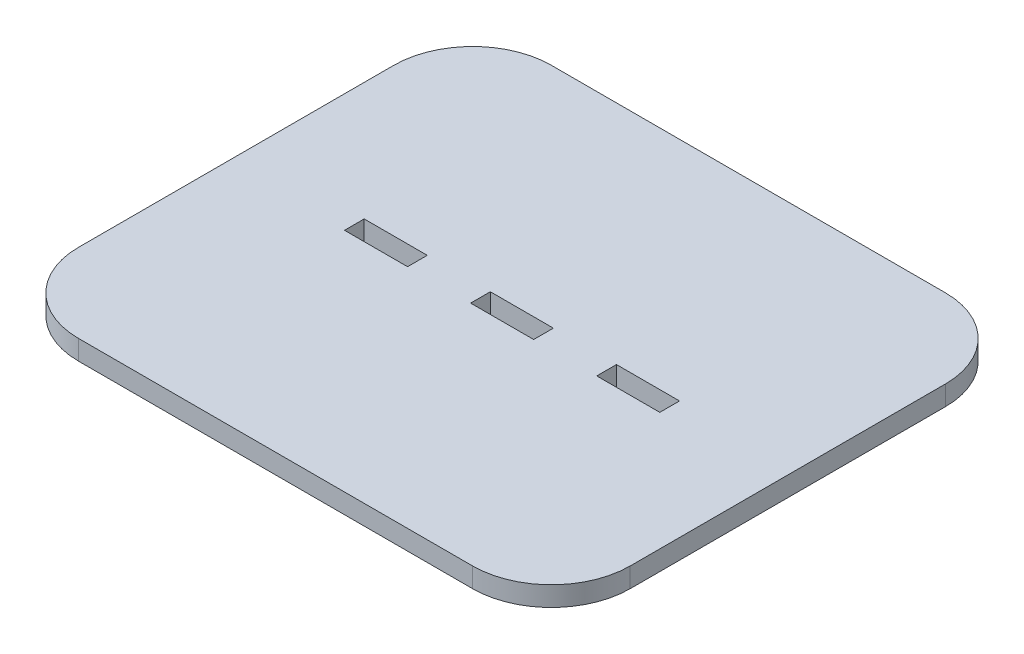
ISO-10303-21;
HEADER;
FILE_DESCRIPTION(('STEP AP214'),'2;1');
FILE_NAME('part.step','',(''),(''),'','','');
FILE_SCHEMA(('AUTOMOTIVE_DESIGN { 1 0 10303 214 1 1 1 1 }'));
ENDSEC;
DATA;
#1=APPLICATION_CONTEXT('core data for automotive mechanical design processes');
#2=APPLICATION_PROTOCOL_DEFINITION('international standard','automotive_design',2000,#1);
#3=PRODUCT_CONTEXT('',#1,'mechanical');
#4=PRODUCT('Part','Part','',(#3));
#5=PRODUCT_RELATED_PRODUCT_CATEGORY('part','',(#4));
#6=PRODUCT_DEFINITION_FORMATION('','',#4);
#7=PRODUCT_DEFINITION_CONTEXT('part definition',#1,'design');
#8=PRODUCT_DEFINITION('design','',#6,#7);
#9=PRODUCT_DEFINITION_SHAPE('','',#8);
#10=(LENGTH_UNIT() NAMED_UNIT(*) SI_UNIT(.MILLI.,.METRE.));
#11=(NAMED_UNIT(*) PLANE_ANGLE_UNIT() SI_UNIT($,.RADIAN.));
#12=(NAMED_UNIT(*) SI_UNIT($,.STERADIAN.) SOLID_ANGLE_UNIT());
#13=UNCERTAINTY_MEASURE_WITH_UNIT(LENGTH_MEASURE(1.E-05),#10,'distance_accuracy_value','');
#14=(GEOMETRIC_REPRESENTATION_CONTEXT(3) GLOBAL_UNCERTAINTY_ASSIGNED_CONTEXT((#13)) GLOBAL_UNIT_ASSIGNED_CONTEXT((#10,
#11,#12)) REPRESENTATION_CONTEXT('',''));
#15=CARTESIAN_POINT('',(0.,0.,0.));
#16=DIRECTION('',(0.,0.,1.));
#17=DIRECTION('',(1.,0.,0.));
#18=AXIS2_PLACEMENT_3D('',#15,#16,#17);
#19=CARTESIAN_POINT('',(-50.,5.,-40.));
#20=DIRECTION('',(0.,-1.,0.));
#21=DIRECTION('',(0.,0.,-1.));
#22=AXIS2_PLACEMENT_3D('',#19,#20,#21);
#23=PLANE('',#22);
#24=DIRECTION('',(1.,0.,0.));
#25=VECTOR('',#24,1.);
#26=CARTESIAN_POINT('',(24.,5.,2.5));
#27=LINE('',#26,#25);
#28=CARTESIAN_POINT('',(24.,5.,2.5));
#29=VERTEX_POINT('',#28);
#30=CARTESIAN_POINT('',(40.,5.,2.5));
#31=VERTEX_POINT('',#30);
#32=EDGE_CURVE('E206',#29,#31,#27,.T.);
#33=ORIENTED_EDGE('',*,*,#32,.F.);
#34=DIRECTION('',(0.,0.,1.));
#35=VECTOR('',#34,1.);
#36=CARTESIAN_POINT('',(24.,5.,-2.5));
#37=LINE('',#36,#35);
#38=CARTESIAN_POINT('',(24.,5.,-2.5));
#39=VERTEX_POINT('',#38);
#40=EDGE_CURVE('E214',#39,#29,#37,.T.);
#41=ORIENTED_EDGE('',*,*,#40,.F.);
#42=DIRECTION('',(-1.,0.,0.));
#43=VECTOR('',#42,1.);
#44=CARTESIAN_POINT('',(24.,5.,-2.5));
#45=LINE('',#44,#43);
#46=CARTESIAN_POINT('',(40.,5.,-2.5));
#47=VERTEX_POINT('',#46);
#48=EDGE_CURVE('E211',#47,#39,#45,.T.);
#49=ORIENTED_EDGE('',*,*,#48,.F.);
#50=DIRECTION('',(0.,0.,-1.));
#51=VECTOR('',#50,1.);
#52=CARTESIAN_POINT('',(40.,5.,-2.5));
#53=LINE('',#52,#51);
#54=EDGE_CURVE('E208',#31,#47,#53,.T.);
#55=ORIENTED_EDGE('',*,*,#54,.F.);
#56=EDGE_LOOP('',(#33,#41,#49,#55));
#57=FACE_BOUND('',#56,.T.);
#58=CARTESIAN_POINT('',(-50.,5.,-40.));
#59=DIRECTION('',(0.,1.,0.));
#60=DIRECTION('',(0.,0.,-1.));
#61=AXIS2_PLACEMENT_3D('',#58,#59,#60);
#62=CIRCLE('',#61,20.);
#63=CARTESIAN_POINT('',(-49.9999999999999,5.,-60.));
#64=VERTEX_POINT('',#63);
#65=CARTESIAN_POINT('',(-70.,5.,-39.9999999999998));
#66=VERTEX_POINT('',#65);
#67=EDGE_CURVE('E268',#64,#66,#62,.T.);
#68=ORIENTED_EDGE('',*,*,#67,.T.);
#69=DIRECTION('',(0.,0.,1.));
#70=VECTOR('',#69,1.);
#71=CARTESIAN_POINT('',(-70.,5.,-39.9999999999998));
#72=LINE('',#71,#70);
#73=CARTESIAN_POINT('',(-70.,5.,39.9999999999999));
#74=VERTEX_POINT('',#73);
#75=EDGE_CURVE('E271',#66,#74,#72,.T.);
#76=ORIENTED_EDGE('',*,*,#75,.T.);
#77=CARTESIAN_POINT('',(-50.,5.,40.));
#78=DIRECTION('',(0.,1.,0.));
#79=DIRECTION('',(0.,0.,-1.));
#80=AXIS2_PLACEMENT_3D('',#77,#78,#79);
#81=CIRCLE('',#80,20.);
#82=CARTESIAN_POINT('',(-49.9999999999999,5.,60.));
#83=VERTEX_POINT('',#82);
#84=EDGE_CURVE('E274',#74,#83,#81,.T.);
#85=ORIENTED_EDGE('',*,*,#84,.T.);
#86=DIRECTION('',(1.,0.,0.));
#87=VECTOR('',#86,1.);
#88=CARTESIAN_POINT('',(-49.9999999999999,5.,60.));
#89=LINE('',#88,#87);
#90=CARTESIAN_POINT('',(49.9999999999999,5.,60.));
#91=VERTEX_POINT('',#90);
#92=EDGE_CURVE('E276',#83,#91,#89,.T.);
#93=ORIENTED_EDGE('',*,*,#92,.T.);
#94=CARTESIAN_POINT('',(50.,5.,40.));
#95=DIRECTION('',(0.,1.,0.));
#96=DIRECTION('',(0.,0.,-1.));
#97=AXIS2_PLACEMENT_3D('',#94,#95,#96);
#98=CIRCLE('',#97,20.);
#99=CARTESIAN_POINT('',(70.,5.,39.9999999999999));
#100=VERTEX_POINT('',#99);
#101=EDGE_CURVE('E278',#91,#100,#98,.T.);
#102=ORIENTED_EDGE('',*,*,#101,.T.);
#103=DIRECTION('',(0.,0.,-1.));
#104=VECTOR('',#103,1.);
#105=CARTESIAN_POINT('',(70.,5.,-39.9999999999999));
#106=LINE('',#105,#104);
#107=CARTESIAN_POINT('',(70.,5.,-39.9999999999999));
#108=VERTEX_POINT('',#107);
#109=EDGE_CURVE('E280',#100,#108,#106,.T.);
#110=ORIENTED_EDGE('',*,*,#109,.T.);
#111=CARTESIAN_POINT('',(50.,5.,-40.));
#112=DIRECTION('',(0.,1.,0.));
#113=DIRECTION('',(0.,0.,-1.));
#114=AXIS2_PLACEMENT_3D('',#111,#112,#113);
#115=CIRCLE('',#114,20.);
#116=CARTESIAN_POINT('',(49.9999999999999,5.,-60.));
#117=VERTEX_POINT('',#116);
#118=EDGE_CURVE('E282',#108,#117,#115,.T.);
#119=ORIENTED_EDGE('',*,*,#118,.T.);
#120=DIRECTION('',(-1.,0.,0.));
#121=VECTOR('',#120,1.);
#122=CARTESIAN_POINT('',(-49.9999999999999,5.,-60.));
#123=LINE('',#122,#121);
#124=EDGE_CURVE('E284',#117,#64,#123,.T.);
#125=ORIENTED_EDGE('',*,*,#124,.T.);
#126=EDGE_LOOP('',(#68,#76,#85,#93,#102,#110,#119,#125));
#127=FACE_BOUND('',#126,.T.);
#128=DIRECTION('',(0.,0.,-1.));
#129=VECTOR('',#128,1.);
#130=CARTESIAN_POINT('',(-24.,5.,-2.5));
#131=LINE('',#130,#129);
#132=CARTESIAN_POINT('',(-24.,5.,2.5));
#133=VERTEX_POINT('',#132);
#134=CARTESIAN_POINT('',(-24.,5.,-2.5));
#135=VERTEX_POINT('',#134);
#136=EDGE_CURVE('E237',#133,#135,#131,.T.);
#137=ORIENTED_EDGE('',*,*,#136,.F.);
#138=DIRECTION('',(1.,0.,0.));
#139=VECTOR('',#138,1.);
#140=CARTESIAN_POINT('',(-40.,5.,2.5));
#141=LINE('',#140,#139);
#142=CARTESIAN_POINT('',(-40.,5.,2.5));
#143=VERTEX_POINT('',#142);
#144=EDGE_CURVE('E245',#143,#133,#141,.T.);
#145=ORIENTED_EDGE('',*,*,#144,.F.);
#146=DIRECTION('',(0.,0.,1.));
#147=VECTOR('',#146,1.);
#148=CARTESIAN_POINT('',(-40.,5.,-2.5));
#149=LINE('',#148,#147);
#150=CARTESIAN_POINT('',(-40.,5.,-2.5));
#151=VERTEX_POINT('',#150);
#152=EDGE_CURVE('E242',#151,#143,#149,.T.);
#153=ORIENTED_EDGE('',*,*,#152,.F.);
#154=DIRECTION('',(-1.,0.,0.));
#155=VECTOR('',#154,1.);
#156=CARTESIAN_POINT('',(-40.,5.,-2.5));
#157=LINE('',#156,#155);
#158=EDGE_CURVE('E239',#135,#151,#157,.T.);
#159=ORIENTED_EDGE('',*,*,#158,.F.);
#160=EDGE_LOOP('',(#137,#145,#153,#159));
#161=FACE_BOUND('',#160,.T.);
#162=DIRECTION('',(0.,0.,1.));
#163=VECTOR('',#162,1.);
#164=CARTESIAN_POINT('',(-7.99999999999997,5.,-2.5));
#165=LINE('',#164,#163);
#166=CARTESIAN_POINT('',(-7.99999999999997,5.,-2.5));
#167=VERTEX_POINT('',#166);
#168=CARTESIAN_POINT('',(-7.99999999999997,5.,2.5));
#169=VERTEX_POINT('',#168);
#170=EDGE_CURVE('E170',#167,#169,#165,.T.);
#171=ORIENTED_EDGE('',*,*,#170,.F.);
#172=DIRECTION('',(-1.,0.,0.));
#173=VECTOR('',#172,1.);
#174=CARTESIAN_POINT('',(-7.99999999999997,5.,-2.5));
#175=LINE('',#174,#173);
#176=CARTESIAN_POINT('',(8.00000000000003,5.,-2.5));
#177=VERTEX_POINT('',#176);
#178=EDGE_CURVE('E192',#177,#167,#175,.T.);
#179=ORIENTED_EDGE('',*,*,#178,.F.);
#180=DIRECTION('',(0.,0.,-1.));
#181=VECTOR('',#180,1.);
#182=CARTESIAN_POINT('',(8.00000000000003,5.,-2.5));
#183=LINE('',#182,#181);
#184=CARTESIAN_POINT('',(8.00000000000003,5.,2.5));
#185=VERTEX_POINT('',#184);
#186=EDGE_CURVE('E190',#185,#177,#183,.T.);
#187=ORIENTED_EDGE('',*,*,#186,.F.);
#188=DIRECTION('',(1.,0.,0.));
#189=VECTOR('',#188,1.);
#190=CARTESIAN_POINT('',(-7.99999999999997,5.,2.5));
#191=LINE('',#190,#189);
#192=EDGE_CURVE('E178',#169,#185,#191,.T.);
#193=ORIENTED_EDGE('',*,*,#192,.F.);
#194=EDGE_LOOP('',(#171,#179,#187,#193));
#195=FACE_BOUND('',#194,.T.);
#196=ADVANCED_FACE('F33',(#57,#127,#161,#195),#23,.F.);
#197=CARTESIAN_POINT('',(-50.,0.,-40.));
#198=DIRECTION('',(0.,-1.,0.));
#199=DIRECTION('',(0.,0.,-1.));
#200=AXIS2_PLACEMENT_3D('',#197,#198,#199);
#201=PLANE('',#200);
#202=CARTESIAN_POINT('',(-50.,0.,-40.));
#203=DIRECTION('',(0.,1.,0.));
#204=DIRECTION('',(0.,0.,-1.));
#205=AXIS2_PLACEMENT_3D('',#202,#203,#204);
#206=CIRCLE('',#205,20.);
#207=CARTESIAN_POINT('',(-49.9999999999999,0.,-60.));
#208=VERTEX_POINT('',#207);
#209=CARTESIAN_POINT('',(-70.,0.,-39.9999999999998));
#210=VERTEX_POINT('',#209);
#211=EDGE_CURVE('E267',#208,#210,#206,.T.);
#212=ORIENTED_EDGE('',*,*,#211,.F.);
#213=DIRECTION('',(-1.,0.,0.));
#214=VECTOR('',#213,1.);
#215=CARTESIAN_POINT('',(-49.9999999999999,0.,-60.));
#216=LINE('',#215,#214);
#217=CARTESIAN_POINT('',(49.9999999999999,0.,-60.));
#218=VERTEX_POINT('',#217);
#219=EDGE_CURVE('E272',#218,#208,#216,.T.);
#220=ORIENTED_EDGE('',*,*,#219,.F.);
#221=CARTESIAN_POINT('',(50.,0.,-40.));
#222=DIRECTION('',(0.,1.,0.));
#223=DIRECTION('',(0.,0.,-1.));
#224=AXIS2_PLACEMENT_3D('',#221,#222,#223);
#225=CIRCLE('',#224,20.);
#226=CARTESIAN_POINT('',(70.,0.,-39.9999999999999));
#227=VERTEX_POINT('',#226);
#228=EDGE_CURVE('E299',#227,#218,#225,.T.);
#229=ORIENTED_EDGE('',*,*,#228,.F.);
#230=DIRECTION('',(0.,0.,-1.));
#231=VECTOR('',#230,1.);
#232=CARTESIAN_POINT('',(70.,0.,-39.9999999999999));
#233=LINE('',#232,#231);
#234=CARTESIAN_POINT('',(70.,0.,39.9999999999999));
#235=VERTEX_POINT('',#234);
#236=EDGE_CURVE('E297',#235,#227,#233,.T.);
#237=ORIENTED_EDGE('',*,*,#236,.F.);
#238=CARTESIAN_POINT('',(50.,0.,40.));
#239=DIRECTION('',(0.,1.,0.));
#240=DIRECTION('',(0.,0.,-1.));
#241=AXIS2_PLACEMENT_3D('',#238,#239,#240);
#242=CIRCLE('',#241,20.);
#243=CARTESIAN_POINT('',(49.9999999999999,0.,60.));
#244=VERTEX_POINT('',#243);
#245=EDGE_CURVE('E295',#244,#235,#242,.T.);
#246=ORIENTED_EDGE('',*,*,#245,.F.);
#247=DIRECTION('',(1.,0.,0.));
#248=VECTOR('',#247,1.);
#249=CARTESIAN_POINT('',(-49.9999999999999,0.,60.));
#250=LINE('',#249,#248);
#251=CARTESIAN_POINT('',(-49.9999999999999,0.,60.));
#252=VERTEX_POINT('',#251);
#253=EDGE_CURVE('E293',#252,#244,#250,.T.);
#254=ORIENTED_EDGE('',*,*,#253,.F.);
#255=CARTESIAN_POINT('',(-50.,0.,40.));
#256=DIRECTION('',(0.,1.,0.));
#257=DIRECTION('',(0.,0.,-1.));
#258=AXIS2_PLACEMENT_3D('',#255,#256,#257);
#259=CIRCLE('',#258,20.);
#260=CARTESIAN_POINT('',(-70.,0.,39.9999999999999));
#261=VERTEX_POINT('',#260);
#262=EDGE_CURVE('E291',#261,#252,#259,.T.);
#263=ORIENTED_EDGE('',*,*,#262,.F.);
#264=DIRECTION('',(0.,0.,1.));
#265=VECTOR('',#264,1.);
#266=CARTESIAN_POINT('',(-70.,0.,-39.9999999999998));
#267=LINE('',#266,#265);
#268=EDGE_CURVE('E289',#210,#261,#267,.T.);
#269=ORIENTED_EDGE('',*,*,#268,.F.);
#270=EDGE_LOOP('',(#212,#220,#229,#237,#246,#254,#263,#269));
#271=FACE_BOUND('',#270,.T.);
#272=DIRECTION('',(1.,0.,0.));
#273=VECTOR('',#272,1.);
#274=CARTESIAN_POINT('',(-40.,0.,2.5));
#275=LINE('',#274,#273);
#276=CARTESIAN_POINT('',(-40.,0.,2.5));
#277=VERTEX_POINT('',#276);
#278=CARTESIAN_POINT('',(-24.,0.,2.5));
#279=VERTEX_POINT('',#278);
#280=EDGE_CURVE('E240',#277,#279,#275,.T.);
#281=ORIENTED_EDGE('',*,*,#280,.T.);
#282=DIRECTION('',(0.,0.,-1.));
#283=VECTOR('',#282,1.);
#284=CARTESIAN_POINT('',(-24.,0.,-2.5));
#285=LINE('',#284,#283);
#286=CARTESIAN_POINT('',(-24.,0.,-2.5));
#287=VERTEX_POINT('',#286);
#288=EDGE_CURVE('E236',#279,#287,#285,.T.);
#289=ORIENTED_EDGE('',*,*,#288,.T.);
#290=DIRECTION('',(-1.,0.,0.));
#291=VECTOR('',#290,1.);
#292=CARTESIAN_POINT('',(-40.,0.,-2.5));
#293=LINE('',#292,#291);
#294=CARTESIAN_POINT('',(-40.,0.,-2.5));
#295=VERTEX_POINT('',#294);
#296=EDGE_CURVE('E250',#287,#295,#293,.T.);
#297=ORIENTED_EDGE('',*,*,#296,.T.);
#298=DIRECTION('',(0.,0.,1.));
#299=VECTOR('',#298,1.);
#300=CARTESIAN_POINT('',(-40.,0.,-2.5));
#301=LINE('',#300,#299);
#302=EDGE_CURVE('E253',#295,#277,#301,.T.);
#303=ORIENTED_EDGE('',*,*,#302,.T.);
#304=EDGE_LOOP('',(#281,#289,#297,#303));
#305=FACE_BOUND('',#304,.T.);
#306=DIRECTION('',(0.,0.,1.));
#307=VECTOR('',#306,1.);
#308=CARTESIAN_POINT('',(24.,0.,-2.5));
#309=LINE('',#308,#307);
#310=CARTESIAN_POINT('',(24.,0.,-2.5));
#311=VERTEX_POINT('',#310);
#312=CARTESIAN_POINT('',(24.,0.,2.5));
#313=VERTEX_POINT('',#312);
#314=EDGE_CURVE('E209',#311,#313,#309,.T.);
#315=ORIENTED_EDGE('',*,*,#314,.T.);
#316=DIRECTION('',(1.,0.,0.));
#317=VECTOR('',#316,1.);
#318=CARTESIAN_POINT('',(24.,0.,2.5));
#319=LINE('',#318,#317);
#320=CARTESIAN_POINT('',(40.,0.,2.5));
#321=VERTEX_POINT('',#320);
#322=EDGE_CURVE('E186',#313,#321,#319,.T.);
#323=ORIENTED_EDGE('',*,*,#322,.T.);
#324=DIRECTION('',(0.,0.,-1.));
#325=VECTOR('',#324,1.);
#326=CARTESIAN_POINT('',(40.,0.,-2.5));
#327=LINE('',#326,#325);
#328=CARTESIAN_POINT('',(40.,0.,-2.5));
#329=VERTEX_POINT('',#328);
#330=EDGE_CURVE('E219',#321,#329,#327,.T.);
#331=ORIENTED_EDGE('',*,*,#330,.T.);
#332=DIRECTION('',(-1.,0.,0.));
#333=VECTOR('',#332,1.);
#334=CARTESIAN_POINT('',(24.,0.,-2.5));
#335=LINE('',#334,#333);
#336=EDGE_CURVE('E222',#329,#311,#335,.T.);
#337=ORIENTED_EDGE('',*,*,#336,.T.);
#338=EDGE_LOOP('',(#315,#323,#331,#337));
#339=FACE_BOUND('',#338,.T.);
#340=DIRECTION('',(-1.,0.,0.));
#341=VECTOR('',#340,1.);
#342=CARTESIAN_POINT('',(-7.99999999999997,0.,-2.5));
#343=LINE('',#342,#341);
#344=CARTESIAN_POINT('',(8.00000000000003,0.,-2.5));
#345=VERTEX_POINT('',#344);
#346=CARTESIAN_POINT('',(-7.99999999999997,0.,-2.5));
#347=VERTEX_POINT('',#346);
#348=EDGE_CURVE('E179',#345,#347,#343,.T.);
#349=ORIENTED_EDGE('',*,*,#348,.T.);
#350=DIRECTION('',(0.,0.,1.));
#351=VECTOR('',#350,1.);
#352=CARTESIAN_POINT('',(-7.99999999999997,0.,-2.5));
#353=LINE('',#352,#351);
#354=CARTESIAN_POINT('',(-7.99999999999997,0.,2.5));
#355=VERTEX_POINT('',#354);
#356=EDGE_CURVE('E56',#347,#355,#353,.T.);
#357=ORIENTED_EDGE('',*,*,#356,.T.);
#358=DIRECTION('',(1.,0.,0.));
#359=VECTOR('',#358,1.);
#360=CARTESIAN_POINT('',(-7.99999999999997,0.,2.5));
#361=LINE('',#360,#359);
#362=CARTESIAN_POINT('',(8.00000000000003,0.,2.5));
#363=VERTEX_POINT('',#362);
#364=EDGE_CURVE('E185',#355,#363,#361,.T.);
#365=ORIENTED_EDGE('',*,*,#364,.T.);
#366=DIRECTION('',(0.,0.,-1.));
#367=VECTOR('',#366,1.);
#368=CARTESIAN_POINT('',(8.00000000000003,0.,-2.5));
#369=LINE('',#368,#367);
#370=EDGE_CURVE('E198',#363,#345,#369,.T.);
#371=ORIENTED_EDGE('',*,*,#370,.T.);
#372=EDGE_LOOP('',(#349,#357,#365,#371));
#373=FACE_BOUND('',#372,.T.);
#374=ADVANCED_FACE('F329',(#271,#305,#339,#373),#201,.T.);
#375=CARTESIAN_POINT('',(-50.,5.,-40.));
#376=DIRECTION('',(0.,-1.,0.));
#377=DIRECTION('',(0.,0.,-1.));
#378=AXIS2_PLACEMENT_3D('',#375,#376,#377);
#379=CYLINDRICAL_SURFACE('',#378,20.);
#380=ORIENTED_EDGE('',*,*,#211,.T.);
#381=DIRECTION('',(0.,-1.,0.));
#382=VECTOR('',#381,1.);
#383=CARTESIAN_POINT('',(-70.,5.,-39.9999999999998));
#384=LINE('',#383,#382);
#385=EDGE_CURVE('E11',#66,#210,#384,.T.);
#386=ORIENTED_EDGE('',*,*,#385,.F.);
#387=ORIENTED_EDGE('',*,*,#67,.F.);
#388=DIRECTION('',(0.,-1.,0.));
#389=VECTOR('',#388,1.);
#390=CARTESIAN_POINT('',(-49.9999999999999,5.,-60.));
#391=LINE('',#390,#389);
#392=EDGE_CURVE('E286',#64,#208,#391,.T.);
#393=ORIENTED_EDGE('',*,*,#392,.T.);
#394=EDGE_LOOP('',(#380,#386,#387,#393));
#395=FACE_BOUND('',#394,.T.);
#396=ADVANCED_FACE('F35',(#395),#379,.T.);
#397=CARTESIAN_POINT('',(-70.,5.,-39.9999999999998));
#398=DIRECTION('',(1.,0.,0.));
#399=DIRECTION('',(0.,0.,-1.));
#400=AXIS2_PLACEMENT_3D('',#397,#398,#399);
#401=PLANE('',#400);
#402=ORIENTED_EDGE('',*,*,#268,.T.);
#403=DIRECTION('',(0.,-1.,0.));
#404=VECTOR('',#403,1.);
#405=CARTESIAN_POINT('',(-70.,5.,39.9999999999999));
#406=LINE('',#405,#404);
#407=EDGE_CURVE('E41',#74,#261,#406,.T.);
#408=ORIENTED_EDGE('',*,*,#407,.F.);
#409=ORIENTED_EDGE('',*,*,#75,.F.);
#410=ORIENTED_EDGE('',*,*,#385,.T.);
#411=EDGE_LOOP('',(#402,#408,#409,#410));
#412=FACE_BOUND('',#411,.T.);
#413=ADVANCED_FACE('F347',(#412),#401,.F.);
#414=CARTESIAN_POINT('',(-50.,5.,40.));
#415=DIRECTION('',(0.,-1.,0.));
#416=DIRECTION('',(0.,0.,-1.));
#417=AXIS2_PLACEMENT_3D('',#414,#415,#416);
#418=CYLINDRICAL_SURFACE('',#417,20.);
#419=ORIENTED_EDGE('',*,*,#262,.T.);
#420=DIRECTION('',(0.,-1.,0.));
#421=VECTOR('',#420,1.);
#422=CARTESIAN_POINT('',(-49.9999999999999,5.,60.));
#423=LINE('',#422,#421);
#424=EDGE_CURVE('E316',#83,#252,#423,.T.);
#425=ORIENTED_EDGE('',*,*,#424,.F.);
#426=ORIENTED_EDGE('',*,*,#84,.F.);
#427=ORIENTED_EDGE('',*,*,#407,.T.);
#428=EDGE_LOOP('',(#419,#425,#426,#427));
#429=FACE_BOUND('',#428,.T.);
#430=ADVANCED_FACE('F323',(#429),#418,.T.);
#431=CARTESIAN_POINT('',(-49.9999999999999,5.,60.));
#432=DIRECTION('',(0.,0.,-1.));
#433=DIRECTION('',(-1.,0.,0.));
#434=AXIS2_PLACEMENT_3D('',#431,#432,#433);
#435=PLANE('',#434);
#436=ORIENTED_EDGE('',*,*,#253,.T.);
#437=DIRECTION('',(0.,-1.,0.));
#438=VECTOR('',#437,1.);
#439=CARTESIAN_POINT('',(49.9999999999999,5.,60.));
#440=LINE('',#439,#438);
#441=EDGE_CURVE('E313',#91,#244,#440,.T.);
#442=ORIENTED_EDGE('',*,*,#441,.F.);
#443=ORIENTED_EDGE('',*,*,#92,.F.);
#444=ORIENTED_EDGE('',*,*,#424,.T.);
#445=EDGE_LOOP('',(#436,#442,#443,#444));
#446=FACE_BOUND('',#445,.T.);
#447=ADVANCED_FACE('F335',(#446),#435,.F.);
#448=CARTESIAN_POINT('',(50.,5.,40.));
#449=DIRECTION('',(0.,-1.,0.));
#450=DIRECTION('',(0.,0.,-1.));
#451=AXIS2_PLACEMENT_3D('',#448,#449,#450);
#452=CYLINDRICAL_SURFACE('',#451,20.);
#453=ORIENTED_EDGE('',*,*,#245,.T.);
#454=DIRECTION('',(0.,-1.,0.));
#455=VECTOR('',#454,1.);
#456=CARTESIAN_POINT('',(70.,5.,39.9999999999999));
#457=LINE('',#456,#455);
#458=EDGE_CURVE('E310',#100,#235,#457,.T.);
#459=ORIENTED_EDGE('',*,*,#458,.F.);
#460=ORIENTED_EDGE('',*,*,#101,.F.);
#461=ORIENTED_EDGE('',*,*,#441,.T.);
#462=EDGE_LOOP('',(#453,#459,#460,#461));
#463=FACE_BOUND('',#462,.T.);
#464=ADVANCED_FACE('F339',(#463),#452,.T.);
#465=CARTESIAN_POINT('',(70.,5.,-39.9999999999999));
#466=DIRECTION('',(-1.,0.,0.));
#467=DIRECTION('',(0.,0.,1.));
#468=AXIS2_PLACEMENT_3D('',#465,#466,#467);
#469=PLANE('',#468);
#470=ORIENTED_EDGE('',*,*,#236,.T.);
#471=DIRECTION('',(0.,-1.,0.));
#472=VECTOR('',#471,1.);
#473=CARTESIAN_POINT('',(70.,5.,-39.9999999999999));
#474=LINE('',#473,#472);
#475=EDGE_CURVE('E307',#108,#227,#474,.T.);
#476=ORIENTED_EDGE('',*,*,#475,.F.);
#477=ORIENTED_EDGE('',*,*,#109,.F.);
#478=ORIENTED_EDGE('',*,*,#458,.T.);
#479=EDGE_LOOP('',(#470,#476,#477,#478));
#480=FACE_BOUND('',#479,.T.);
#481=ADVANCED_FACE('F360',(#480),#469,.F.);
#482=CARTESIAN_POINT('',(50.,5.,-40.));
#483=DIRECTION('',(0.,-1.,0.));
#484=DIRECTION('',(0.,0.,-1.));
#485=AXIS2_PLACEMENT_3D('',#482,#483,#484);
#486=CYLINDRICAL_SURFACE('',#485,20.);
#487=ORIENTED_EDGE('',*,*,#228,.T.);
#488=DIRECTION('',(0.,-1.,0.));
#489=VECTOR('',#488,1.);
#490=CARTESIAN_POINT('',(49.9999999999999,5.,-60.));
#491=LINE('',#490,#489);
#492=EDGE_CURVE('E304',#117,#218,#491,.T.);
#493=ORIENTED_EDGE('',*,*,#492,.F.);
#494=ORIENTED_EDGE('',*,*,#118,.F.);
#495=ORIENTED_EDGE('',*,*,#475,.T.);
#496=EDGE_LOOP('',(#487,#493,#494,#495));
#497=FACE_BOUND('',#496,.T.);
#498=ADVANCED_FACE('F358',(#497),#486,.T.);
#499=CARTESIAN_POINT('',(-49.9999999999999,5.,-60.));
#500=DIRECTION('',(0.,0.,1.));
#501=DIRECTION('',(1.,0.,0.));
#502=AXIS2_PLACEMENT_3D('',#499,#500,#501);
#503=PLANE('',#502);
#504=ORIENTED_EDGE('',*,*,#219,.T.);
#505=ORIENTED_EDGE('',*,*,#392,.F.);
#506=ORIENTED_EDGE('',*,*,#124,.F.);
#507=ORIENTED_EDGE('',*,*,#492,.T.);
#508=EDGE_LOOP('',(#504,#505,#506,#507));
#509=FACE_BOUND('',#508,.T.);
#510=ADVANCED_FACE('F353',(#509),#503,.F.);
#511=CARTESIAN_POINT('',(-24.,5.,-2.5));
#512=DIRECTION('',(-1.,0.,0.));
#513=DIRECTION('',(0.,0.,1.));
#514=AXIS2_PLACEMENT_3D('',#511,#512,#513);
#515=PLANE('',#514);
#516=ORIENTED_EDGE('',*,*,#288,.F.);
#517=DIRECTION('',(0.,-1.,0.));
#518=VECTOR('',#517,1.);
#519=CARTESIAN_POINT('',(-24.,5.,2.5));
#520=LINE('',#519,#518);
#521=EDGE_CURVE('E247',#133,#279,#520,.T.);
#522=ORIENTED_EDGE('',*,*,#521,.F.);
#523=ORIENTED_EDGE('',*,*,#136,.T.);
#524=DIRECTION('',(0.,-1.,0.));
#525=VECTOR('',#524,1.);
#526=CARTESIAN_POINT('',(-24.,5.,-2.5));
#527=LINE('',#526,#525);
#528=EDGE_CURVE('E264',#135,#287,#527,.T.);
#529=ORIENTED_EDGE('',*,*,#528,.T.);
#530=EDGE_LOOP('',(#516,#522,#523,#529));
#531=FACE_BOUND('',#530,.T.);
#532=ADVANCED_FACE('F378',(#531),#515,.T.);
#533=CARTESIAN_POINT('',(-40.,5.,-2.5));
#534=DIRECTION('',(0.,0.,1.));
#535=DIRECTION('',(1.,0.,0.));
#536=AXIS2_PLACEMENT_3D('',#533,#534,#535);
#537=PLANE('',#536);
#538=ORIENTED_EDGE('',*,*,#296,.F.);
#539=ORIENTED_EDGE('',*,*,#528,.F.);
#540=ORIENTED_EDGE('',*,*,#158,.T.);
#541=DIRECTION('',(0.,-1.,0.));
#542=VECTOR('',#541,1.);
#543=CARTESIAN_POINT('',(-40.,5.,-2.5));
#544=LINE('',#543,#542);
#545=EDGE_CURVE('E262',#151,#295,#544,.T.);
#546=ORIENTED_EDGE('',*,*,#545,.T.);
#547=EDGE_LOOP('',(#538,#539,#540,#546));
#548=FACE_BOUND('',#547,.T.);
#549=ADVANCED_FACE('F385',(#548),#537,.T.);
#550=CARTESIAN_POINT('',(-40.,5.,-2.5));
#551=DIRECTION('',(1.,0.,0.));
#552=DIRECTION('',(0.,0.,-1.));
#553=AXIS2_PLACEMENT_3D('',#550,#551,#552);
#554=PLANE('',#553);
#555=ORIENTED_EDGE('',*,*,#302,.F.);
#556=ORIENTED_EDGE('',*,*,#545,.F.);
#557=ORIENTED_EDGE('',*,*,#152,.T.);
#558=DIRECTION('',(0.,-1.,0.));
#559=VECTOR('',#558,1.);
#560=CARTESIAN_POINT('',(-40.,5.,2.5));
#561=LINE('',#560,#559);
#562=EDGE_CURVE('E260',#143,#277,#561,.T.);
#563=ORIENTED_EDGE('',*,*,#562,.T.);
#564=EDGE_LOOP('',(#555,#556,#557,#563));
#565=FACE_BOUND('',#564,.T.);
#566=ADVANCED_FACE('F390',(#565),#554,.T.);
#567=CARTESIAN_POINT('',(-40.,5.,2.5));
#568=DIRECTION('',(0.,0.,-1.));
#569=DIRECTION('',(-1.,0.,0.));
#570=AXIS2_PLACEMENT_3D('',#567,#568,#569);
#571=PLANE('',#570);
#572=ORIENTED_EDGE('',*,*,#280,.F.);
#573=ORIENTED_EDGE('',*,*,#562,.F.);
#574=ORIENTED_EDGE('',*,*,#144,.T.);
#575=ORIENTED_EDGE('',*,*,#521,.T.);
#576=EDGE_LOOP('',(#572,#573,#574,#575));
#577=FACE_BOUND('',#576,.T.);
#578=ADVANCED_FACE('F397',(#577),#571,.T.);
#579=CARTESIAN_POINT('',(24.,5.,2.5));
#580=DIRECTION('',(0.,0.,-1.));
#581=DIRECTION('',(-1.,0.,0.));
#582=AXIS2_PLACEMENT_3D('',#579,#580,#581);
#583=PLANE('',#582);
#584=ORIENTED_EDGE('',*,*,#322,.F.);
#585=DIRECTION('',(0.,-1.,0.));
#586=VECTOR('',#585,1.);
#587=CARTESIAN_POINT('',(24.,5.,2.5));
#588=LINE('',#587,#586);
#589=EDGE_CURVE('E216',#29,#313,#588,.T.);
#590=ORIENTED_EDGE('',*,*,#589,.F.);
#591=ORIENTED_EDGE('',*,*,#32,.T.);
#592=DIRECTION('',(0.,-1.,0.));
#593=VECTOR('',#592,1.);
#594=CARTESIAN_POINT('',(40.,5.,2.5));
#595=LINE('',#594,#593);
#596=EDGE_CURVE('E233',#31,#321,#595,.T.);
#597=ORIENTED_EDGE('',*,*,#596,.T.);
#598=EDGE_LOOP('',(#584,#590,#591,#597));
#599=FACE_BOUND('',#598,.T.);
#600=ADVANCED_FACE('F410',(#599),#583,.T.);
#601=CARTESIAN_POINT('',(40.,5.,-2.5));
#602=DIRECTION('',(-1.,0.,0.));
#603=DIRECTION('',(0.,0.,1.));
#604=AXIS2_PLACEMENT_3D('',#601,#602,#603);
#605=PLANE('',#604);
#606=ORIENTED_EDGE('',*,*,#330,.F.);
#607=ORIENTED_EDGE('',*,*,#596,.F.);
#608=ORIENTED_EDGE('',*,*,#54,.T.);
#609=DIRECTION('',(0.,-1.,0.));
#610=VECTOR('',#609,1.);
#611=CARTESIAN_POINT('',(40.,5.,-2.5));
#612=LINE('',#611,#610);
#613=EDGE_CURVE('E231',#47,#329,#612,.T.);
#614=ORIENTED_EDGE('',*,*,#613,.T.);
#615=EDGE_LOOP('',(#606,#607,#608,#614));
#616=FACE_BOUND('',#615,.T.);
#617=ADVANCED_FACE('F415',(#616),#605,.T.);
#618=CARTESIAN_POINT('',(24.,5.,-2.5));
#619=DIRECTION('',(0.,0.,1.));
#620=DIRECTION('',(1.,0.,0.));
#621=AXIS2_PLACEMENT_3D('',#618,#619,#620);
#622=PLANE('',#621);
#623=ORIENTED_EDGE('',*,*,#336,.F.);
#624=ORIENTED_EDGE('',*,*,#613,.F.);
#625=ORIENTED_EDGE('',*,*,#48,.T.);
#626=DIRECTION('',(0.,-1.,0.));
#627=VECTOR('',#626,1.);
#628=CARTESIAN_POINT('',(24.,5.,-2.5));
#629=LINE('',#628,#627);
#630=EDGE_CURVE('E229',#39,#311,#629,.T.);
#631=ORIENTED_EDGE('',*,*,#630,.T.);
#632=EDGE_LOOP('',(#623,#624,#625,#631));
#633=FACE_BOUND('',#632,.T.);
#634=ADVANCED_FACE('F419',(#633),#622,.T.);
#635=CARTESIAN_POINT('',(24.,5.,-2.5));
#636=DIRECTION('',(1.,0.,0.));
#637=DIRECTION('',(0.,0.,-1.));
#638=AXIS2_PLACEMENT_3D('',#635,#636,#637);
#639=PLANE('',#638);
#640=ORIENTED_EDGE('',*,*,#314,.F.);
#641=ORIENTED_EDGE('',*,*,#630,.F.);
#642=ORIENTED_EDGE('',*,*,#40,.T.);
#643=ORIENTED_EDGE('',*,*,#589,.T.);
#644=EDGE_LOOP('',(#640,#641,#642,#643));
#645=FACE_BOUND('',#644,.T.);
#646=ADVANCED_FACE('F423',(#645),#639,.T.);
#647=CARTESIAN_POINT('',(-7.99999999999997,5.,-2.5));
#648=DIRECTION('',(1.,0.,0.));
#649=DIRECTION('',(0.,0.,-1.));
#650=AXIS2_PLACEMENT_3D('',#647,#648,#649);
#651=PLANE('',#650);
#652=ORIENTED_EDGE('',*,*,#356,.F.);
#653=DIRECTION('',(0.,-1.,0.));
#654=VECTOR('',#653,1.);
#655=CARTESIAN_POINT('',(-7.99999999999997,5.,-2.5));
#656=LINE('',#655,#654);
#657=EDGE_CURVE('E174',#167,#347,#656,.T.);
#658=ORIENTED_EDGE('',*,*,#657,.F.);
#659=ORIENTED_EDGE('',*,*,#170,.T.);
#660=DIRECTION('',(0.,-1.,0.));
#661=VECTOR('',#660,1.);
#662=CARTESIAN_POINT('',(-7.99999999999997,5.,2.5));
#663=LINE('',#662,#661);
#664=EDGE_CURVE('E173',#169,#355,#663,.T.);
#665=ORIENTED_EDGE('',*,*,#664,.T.);
#666=EDGE_LOOP('',(#652,#658,#659,#665));
#667=FACE_BOUND('',#666,.T.);
#668=ADVANCED_FACE('F172',(#667),#651,.T.);
#669=CARTESIAN_POINT('',(-7.99999999999997,5.,2.5));
#670=DIRECTION('',(0.,0.,-1.));
#671=DIRECTION('',(-1.,0.,0.));
#672=AXIS2_PLACEMENT_3D('',#669,#670,#671);
#673=PLANE('',#672);
#674=ORIENTED_EDGE('',*,*,#364,.F.);
#675=ORIENTED_EDGE('',*,*,#664,.F.);
#676=ORIENTED_EDGE('',*,*,#192,.T.);
#677=DIRECTION('',(0.,-1.,0.));
#678=VECTOR('',#677,1.);
#679=CARTESIAN_POINT('',(8.00000000000003,5.,2.5));
#680=LINE('',#679,#678);
#681=EDGE_CURVE('E187',#185,#363,#680,.T.);
#682=ORIENTED_EDGE('',*,*,#681,.T.);
#683=EDGE_LOOP('',(#674,#675,#676,#682));
#684=FACE_BOUND('',#683,.T.);
#685=ADVANCED_FACE('F182',(#684),#673,.T.);
#686=CARTESIAN_POINT('',(8.00000000000003,5.,-2.5));
#687=DIRECTION('',(-1.,0.,0.));
#688=DIRECTION('',(0.,0.,1.));
#689=AXIS2_PLACEMENT_3D('',#686,#687,#688);
#690=PLANE('',#689);
#691=ORIENTED_EDGE('',*,*,#370,.F.);
#692=ORIENTED_EDGE('',*,*,#681,.F.);
#693=ORIENTED_EDGE('',*,*,#186,.T.);
#694=DIRECTION('',(0.,-1.,0.));
#695=VECTOR('',#694,1.);
#696=CARTESIAN_POINT('',(8.00000000000003,5.,-2.5));
#697=LINE('',#696,#695);
#698=EDGE_CURVE('E48',#177,#345,#697,.T.);
#699=ORIENTED_EDGE('',*,*,#698,.T.);
#700=EDGE_LOOP('',(#691,#692,#693,#699));
#701=FACE_BOUND('',#700,.T.);
#702=ADVANCED_FACE('F432',(#701),#690,.T.);
#703=CARTESIAN_POINT('',(-7.99999999999997,5.,-2.5));
#704=DIRECTION('',(0.,0.,1.));
#705=DIRECTION('',(1.,0.,0.));
#706=AXIS2_PLACEMENT_3D('',#703,#704,#705);
#707=PLANE('',#706);
#708=ORIENTED_EDGE('',*,*,#348,.F.);
#709=ORIENTED_EDGE('',*,*,#698,.F.);
#710=ORIENTED_EDGE('',*,*,#178,.T.);
#711=ORIENTED_EDGE('',*,*,#657,.T.);
#712=EDGE_LOOP('',(#708,#709,#710,#711));
#713=FACE_BOUND('',#712,.T.);
#714=ADVANCED_FACE('F435',(#713),#707,.T.);
#715=CLOSED_SHELL('',(#196,#374,#396,#413,#430,#447,#464,#481,#498,#510,#532,#549,#566,#578,
#600,#617,#634,#646,#668,#685,#702,#714));
#716=MANIFOLD_SOLID_BREP('B2',#715);
#717=ADVANCED_BREP_SHAPE_REPRESENTATION('',(#18,#716),#14);
#718=SHAPE_DEFINITION_REPRESENTATION(#9,#717);
ENDSEC;
END-ISO-10303-21;
